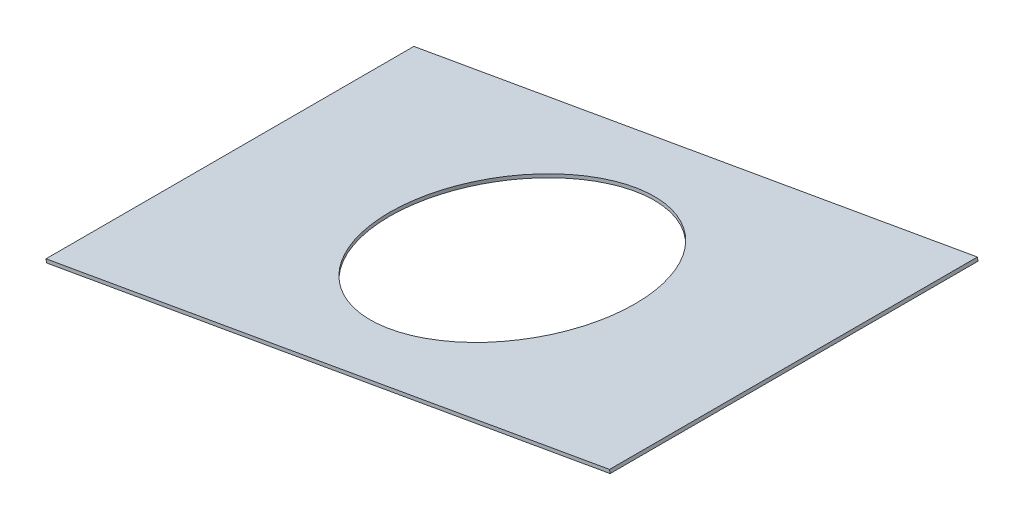
ISO-10303-21;
HEADER;
FILE_DESCRIPTION(('STEP AP214'),'2;1');
FILE_NAME('part.step','',(''),(''),'','','');
FILE_SCHEMA(('AUTOMOTIVE_DESIGN { 1 0 10303 214 1 1 1 1 }'));
ENDSEC;
DATA;
#1=APPLICATION_CONTEXT('core data for automotive mechanical design processes');
#2=APPLICATION_PROTOCOL_DEFINITION('international standard','automotive_design',2000,#1);
#3=PRODUCT_CONTEXT('',#1,'mechanical');
#4=PRODUCT('Part','Part','',(#3));
#5=PRODUCT_RELATED_PRODUCT_CATEGORY('part','',(#4));
#6=PRODUCT_DEFINITION_FORMATION('','',#4);
#7=PRODUCT_DEFINITION_CONTEXT('part definition',#1,'design');
#8=PRODUCT_DEFINITION('design','',#6,#7);
#9=PRODUCT_DEFINITION_SHAPE('','',#8);
#10=(LENGTH_UNIT() NAMED_UNIT(*) SI_UNIT(.MILLI.,.METRE.));
#11=(NAMED_UNIT(*) PLANE_ANGLE_UNIT() SI_UNIT($,.RADIAN.));
#12=(NAMED_UNIT(*) SI_UNIT($,.STERADIAN.) SOLID_ANGLE_UNIT());
#13=UNCERTAINTY_MEASURE_WITH_UNIT(LENGTH_MEASURE(1.E-05),#10,'distance_accuracy_value','');
#14=(GEOMETRIC_REPRESENTATION_CONTEXT(3) GLOBAL_UNCERTAINTY_ASSIGNED_CONTEXT((#13)) GLOBAL_UNIT_ASSIGNED_CONTEXT((#10,
#11,#12)) REPRESENTATION_CONTEXT('',''));
#15=CARTESIAN_POINT('',(0.,0.,0.));
#16=DIRECTION('',(0.,0.,1.));
#17=DIRECTION('',(1.,0.,0.));
#18=AXIS2_PLACEMENT_3D('',#15,#16,#17);
#19=CARTESIAN_POINT('',(-414.487497153462,-33.0081958550479,270.));
#20=DIRECTION('',(0.984807753012208,0.17364817766693,0.));
#21=DIRECTION('',(-0.17364817766693,0.984807753012208,0.));
#22=AXIS2_PLACEMENT_3D('',#19,#20,#21);
#23=PLANE('',#22);
#24=DIRECTION('',(0.17364817766693,-0.984807753012208,0.));
#25=VECTOR('',#24,1.);
#26=CARTESIAN_POINT('',(-414.487497153462,-33.0081958550479,-270.));
#27=LINE('',#26,#25);
#28=CARTESIAN_POINT('',(-414.487497153462,-33.0081958550479,-270.));
#29=VERTEX_POINT('',#28);
#30=CARTESIAN_POINT('',(-413.619256265128,-37.9322346201089,-270.));
#31=VERTEX_POINT('',#30);
#32=EDGE_CURVE('E95',#29,#31,#27,.T.);
#33=ORIENTED_EDGE('',*,*,#32,.T.);
#34=DIRECTION('',(0.,0.,-1.));
#35=VECTOR('',#34,1.);
#36=CARTESIAN_POINT('',(-413.619256265128,-37.9322346201089,270.));
#37=LINE('',#36,#35);
#38=CARTESIAN_POINT('',(-413.619256265128,-37.9322346201089,270.));
#39=VERTEX_POINT('',#38);
#40=EDGE_CURVE('E11',#39,#31,#37,.T.);
#41=ORIENTED_EDGE('',*,*,#40,.F.);
#42=DIRECTION('',(0.17364817766693,-0.984807753012208,0.));
#43=VECTOR('',#42,1.);
#44=CARTESIAN_POINT('',(-414.487497153462,-33.0081958550479,270.));
#45=LINE('',#44,#43);
#46=CARTESIAN_POINT('',(-414.487497153462,-33.0081958550479,270.));
#47=VERTEX_POINT('',#46);
#48=EDGE_CURVE('E83',#47,#39,#45,.T.);
#49=ORIENTED_EDGE('',*,*,#48,.F.);
#50=DIRECTION('',(0.,0.,-1.));
#51=VECTOR('',#50,1.);
#52=CARTESIAN_POINT('',(-414.487497153462,-33.0081958550479,270.));
#53=LINE('',#52,#51);
#54=EDGE_CURVE('E91',#47,#29,#53,.T.);
#55=ORIENTED_EDGE('',*,*,#54,.T.);
#56=EDGE_LOOP('',(#33,#41,#49,#55));
#57=FACE_BOUND('',#56,.T.);
#58=ADVANCED_FACE('F32',(#57),#23,.F.);
#59=CARTESIAN_POINT('',(-413.619256265128,-37.9322346201089,270.));
#60=DIRECTION('',(-0.173648177666932,0.984807753012208,0.));
#61=DIRECTION('',(-0.984807753012208,-0.173648177666932,0.));
#62=AXIS2_PLACEMENT_3D('',#59,#60,#61);
#63=PLANE('',#62);
#64=CARTESIAN_POINT('',(0.,35.0000000000024,0.));
#65=DIRECTION('',(-0.173648177666932,0.984807753012208,0.));
#66=DIRECTION('',(-0.984807753012208,-0.173648177666932,0.));
#67=AXIS2_PLACEMENT_3D('',#64,#65,#66);
#68=ELLIPSE('',#67,182.776790139434,180.);
#69=CARTESIAN_POINT('',(-180.,3.26114347247843,0.));
#70=VERTEX_POINT('',#69);
#71=EDGE_CURVE('E98',#70,#70,#68,.F.);
#72=ORIENTED_EDGE('',*,*,#71,.F.);
#73=EDGE_LOOP('',(#72));
#74=FACE_BOUND('',#73,.T.);
#75=DIRECTION('',(0.984807753012208,0.173648177666932,0.));
#76=VECTOR('',#75,1.);
#77=CARTESIAN_POINT('',(-413.619256265128,-37.9322346201089,-270.));
#78=LINE('',#77,#76);
#79=CARTESIAN_POINT('',(413.619256265127,107.932234620114,-270.));
#80=VERTEX_POINT('',#79);
#81=EDGE_CURVE('E87',#31,#80,#78,.T.);
#82=ORIENTED_EDGE('',*,*,#81,.T.);
#83=DIRECTION('',(0.,0.,-1.));
#84=VECTOR('',#83,1.);
#85=CARTESIAN_POINT('',(413.619256265127,107.932234620114,270.));
#86=LINE('',#85,#84);
#87=CARTESIAN_POINT('',(413.619256265127,107.932234620114,270.));
#88=VERTEX_POINT('',#87);
#89=EDGE_CURVE('E40',#88,#80,#86,.T.);
#90=ORIENTED_EDGE('',*,*,#89,.F.);
#91=DIRECTION('',(0.984807753012208,0.173648177666932,0.));
#92=VECTOR('',#91,1.);
#93=CARTESIAN_POINT('',(-413.619256265128,-37.9322346201089,270.));
#94=LINE('',#93,#92);
#95=EDGE_CURVE('E78',#39,#88,#94,.T.);
#96=ORIENTED_EDGE('',*,*,#95,.F.);
#97=ORIENTED_EDGE('',*,*,#40,.T.);
#98=EDGE_LOOP('',(#82,#90,#96,#97));
#99=FACE_BOUND('',#98,.T.);
#100=ADVANCED_FACE('F86',(#74,#99),#63,.F.);
#101=CARTESIAN_POINT('',(412.751015376792,112.856273385175,270.));
#102=DIRECTION('',(-0.98480775301221,-0.17364817766692,0.));
#103=DIRECTION('',(0.17364817766692,-0.98480775301221,0.));
#104=AXIS2_PLACEMENT_3D('',#101,#102,#103);
#105=PLANE('',#104);
#106=DIRECTION('',(-0.17364817766692,0.98480775301221,0.));
#107=VECTOR('',#106,1.);
#108=CARTESIAN_POINT('',(412.751015376792,112.856273385175,-270.));
#109=LINE('',#108,#107);
#110=CARTESIAN_POINT('',(412.751015376792,112.856273385175,-270.));
#111=VERTEX_POINT('',#110);
#112=EDGE_CURVE('E65',#80,#111,#109,.T.);
#113=ORIENTED_EDGE('',*,*,#112,.T.);
#114=DIRECTION('',(0.,0.,-1.));
#115=VECTOR('',#114,1.);
#116=CARTESIAN_POINT('',(412.751015376792,112.856273385175,270.));
#117=LINE('',#116,#115);
#118=CARTESIAN_POINT('',(412.751015376792,112.856273385175,270.));
#119=VERTEX_POINT('',#118);
#120=EDGE_CURVE('E88',#119,#111,#117,.T.);
#121=ORIENTED_EDGE('',*,*,#120,.F.);
#122=DIRECTION('',(-0.17364817766692,0.98480775301221,0.));
#123=VECTOR('',#122,1.);
#124=CARTESIAN_POINT('',(412.751015376792,112.856273385175,270.));
#125=LINE('',#124,#123);
#126=EDGE_CURVE('E81',#88,#119,#125,.T.);
#127=ORIENTED_EDGE('',*,*,#126,.F.);
#128=ORIENTED_EDGE('',*,*,#89,.T.);
#129=EDGE_LOOP('',(#113,#121,#127,#128));
#130=FACE_BOUND('',#129,.T.);
#131=ADVANCED_FACE('F89',(#130),#105,.F.);
#132=CARTESIAN_POINT('',(-414.487497153462,-33.0081958550479,270.));
#133=DIRECTION('',(0.173648177666932,-0.984807753012208,0.));
#134=DIRECTION('',(0.984807753012208,0.173648177666932,0.));
#135=AXIS2_PLACEMENT_3D('',#132,#133,#134);
#136=PLANE('',#135);
#137=CARTESIAN_POINT('',(0.,40.0771330594312,0.));
#138=DIRECTION('',(0.173648177666932,-0.984807753012208,0.));
#139=DIRECTION('',(-0.984807753012208,-0.173648177666932,0.));
#140=AXIS2_PLACEMENT_3D('',#137,#138,#139);
#141=ELLIPSE('',#140,182.776790139434,180.);
#142=CARTESIAN_POINT('',(-180.,8.33827653190724,0.));
#143=VERTEX_POINT('',#142);
#144=EDGE_CURVE('E111',#143,#143,#141,.T.);
#145=ORIENTED_EDGE('',*,*,#144,.T.);
#146=EDGE_LOOP('',(#145));
#147=FACE_BOUND('',#146,.T.);
#148=DIRECTION('',(-0.984807753012208,-0.173648177666932,0.));
#149=VECTOR('',#148,1.);
#150=CARTESIAN_POINT('',(-414.487497153462,-33.0081958550479,-270.));
#151=LINE('',#150,#149);
#152=EDGE_CURVE('E71',#111,#29,#151,.T.);
#153=ORIENTED_EDGE('',*,*,#152,.T.);
#154=ORIENTED_EDGE('',*,*,#54,.F.);
#155=DIRECTION('',(-0.984807753012208,-0.173648177666932,0.));
#156=VECTOR('',#155,1.);
#157=CARTESIAN_POINT('',(-414.487497153462,-33.0081958550479,270.));
#158=LINE('',#157,#156);
#159=EDGE_CURVE('E48',#119,#47,#158,.T.);
#160=ORIENTED_EDGE('',*,*,#159,.F.);
#161=ORIENTED_EDGE('',*,*,#120,.T.);
#162=EDGE_LOOP('',(#153,#154,#160,#161));
#163=FACE_BOUND('',#162,.T.);
#164=ADVANCED_FACE('F103',(#147,#163),#136,.F.);
#165=CARTESIAN_POINT('',(0.,0.,270.));
#166=DIRECTION('',(0.,0.,1.));
#167=DIRECTION('',(1.,0.,0.));
#168=AXIS2_PLACEMENT_3D('',#165,#166,#167);
#169=PLANE('',#168);
#170=ORIENTED_EDGE('',*,*,#48,.T.);
#171=ORIENTED_EDGE('',*,*,#95,.T.);
#172=ORIENTED_EDGE('',*,*,#126,.T.);
#173=ORIENTED_EDGE('',*,*,#159,.T.);
#174=EDGE_LOOP('',(#170,#171,#172,#173));
#175=FACE_BOUND('',#174,.T.);
#176=ADVANCED_FACE('F79',(#175),#169,.T.);
#177=CARTESIAN_POINT('',(0.,0.,-270.));
#178=DIRECTION('',(0.,0.,1.));
#179=DIRECTION('',(1.,0.,0.));
#180=AXIS2_PLACEMENT_3D('',#177,#178,#179);
#181=PLANE('',#180);
#182=ORIENTED_EDGE('',*,*,#32,.F.);
#183=ORIENTED_EDGE('',*,*,#152,.F.);
#184=ORIENTED_EDGE('',*,*,#112,.F.);
#185=ORIENTED_EDGE('',*,*,#81,.F.);
#186=EDGE_LOOP('',(#182,#183,#184,#185));
#187=FACE_BOUND('',#186,.T.);
#188=ADVANCED_FACE('F106',(#187),#181,.F.);
#189=CARTESIAN_POINT('',(0.,553.120989788797,0.));
#190=DIRECTION('',(0.,-1.,0.));
#191=DIRECTION('',(0.,0.,-1.));
#192=AXIS2_PLACEMENT_3D('',#189,#190,#191);
#193=CYLINDRICAL_SURFACE('',#192,180.);
#194=ORIENTED_EDGE('',*,*,#144,.F.);
#195=EDGE_LOOP('',(#194));
#196=FACE_BOUND('',#195,.T.);
#197=ORIENTED_EDGE('',*,*,#71,.T.);
#198=EDGE_LOOP('',(#197));
#199=FACE_BOUND('',#198,.T.);
#200=ADVANCED_FACE('F116',(#196,#199),#193,.F.);
#201=CLOSED_SHELL('',(#58,#100,#131,#164,#176,#188,#200));
#202=MANIFOLD_SOLID_BREP('B2',#201);
#203=ADVANCED_BREP_SHAPE_REPRESENTATION('',(#18,#202),#14);
#204=SHAPE_DEFINITION_REPRESENTATION(#9,#203);
ENDSEC;
END-ISO-10303-21;
